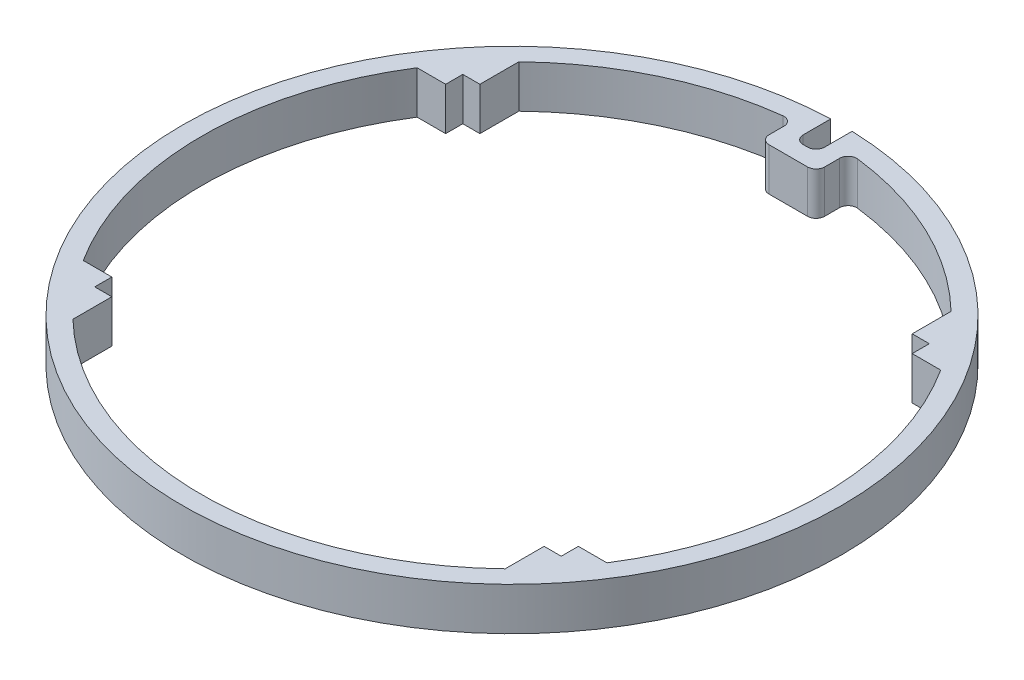
ISO-10303-21;
HEADER;
FILE_DESCRIPTION(('STEP AP214'),'2;1');
FILE_NAME('part.step','',(''),(''),'','','');
FILE_SCHEMA(('AUTOMOTIVE_DESIGN { 1 0 10303 214 1 1 1 1 }'));
ENDSEC;
DATA;
#1=APPLICATION_CONTEXT('core data for automotive mechanical design processes');
#2=APPLICATION_PROTOCOL_DEFINITION('international standard','automotive_design',2000,#1);
#3=PRODUCT_CONTEXT('',#1,'mechanical');
#4=PRODUCT('Part','Part','',(#3));
#5=PRODUCT_RELATED_PRODUCT_CATEGORY('part','',(#4));
#6=PRODUCT_DEFINITION_FORMATION('','',#4);
#7=PRODUCT_DEFINITION_CONTEXT('part definition',#1,'design');
#8=PRODUCT_DEFINITION('design','',#6,#7);
#9=PRODUCT_DEFINITION_SHAPE('','',#8);
#10=(LENGTH_UNIT() NAMED_UNIT(*) SI_UNIT(.MILLI.,.METRE.));
#11=(NAMED_UNIT(*) PLANE_ANGLE_UNIT() SI_UNIT($,.RADIAN.));
#12=(NAMED_UNIT(*) SI_UNIT($,.STERADIAN.) SOLID_ANGLE_UNIT());
#13=UNCERTAINTY_MEASURE_WITH_UNIT(LENGTH_MEASURE(1.E-05),#10,'distance_accuracy_value','');
#14=(GEOMETRIC_REPRESENTATION_CONTEXT(3) GLOBAL_UNCERTAINTY_ASSIGNED_CONTEXT((#13)) GLOBAL_UNIT_ASSIGNED_CONTEXT((#10,
#11,#12)) REPRESENTATION_CONTEXT('',''));
#15=CARTESIAN_POINT('',(0.,0.,0.));
#16=DIRECTION('',(0.,0.,1.));
#17=DIRECTION('',(1.,0.,0.));
#18=AXIS2_PLACEMENT_3D('',#15,#16,#17);
#19=CARTESIAN_POINT('',(0.,10.,0.));
#20=DIRECTION('',(0.,1.,0.));
#21=DIRECTION('',(0.,0.,1.));
#22=AXIS2_PLACEMENT_3D('',#19,#20,#21);
#23=PLANE('',#22);
#24=DIRECTION('',(0.,0.,-1.));
#25=VECTOR('',#24,1.);
#26=CARTESIAN_POINT('',(-2.5,10.,-76.5091661175313));
#27=LINE('',#26,#25);
#28=CARTESIAN_POINT('',(-2.5,10.,-70.5483094985375));
#29=VERTEX_POINT('',#28);
#30=CARTESIAN_POINT('',(-2.49999999999997,10.,-76.9594048833539));
#31=VERTEX_POINT('',#30);
#32=EDGE_CURVE('E670',#29,#31,#27,.T.);
#33=ORIENTED_EDGE('',*,*,#32,.T.);
#34=CARTESIAN_POINT('',(0.,10.,0.));
#35=DIRECTION('',(0.,1.,0.));
#36=DIRECTION('',(0.,0.,1.));
#37=AXIS2_PLACEMENT_3D('',#34,#35,#36);
#38=CIRCLE('',#37,77.);
#39=CARTESIAN_POINT('',(2.49999999999999,10.,-76.9594048833539));
#40=VERTEX_POINT('',#39);
#41=EDGE_CURVE('E363',#31,#40,#38,.T.);
#42=ORIENTED_EDGE('',*,*,#41,.T.);
#43=DIRECTION('',(0.,0.,1.));
#44=VECTOR('',#43,1.);
#45=CARTESIAN_POINT('',(2.5,10.,-76.5091661175313));
#46=LINE('',#45,#44);
#47=CARTESIAN_POINT('',(2.5,10.,-70.5483094985375));
#48=VERTEX_POINT('',#47);
#49=EDGE_CURVE('E354',#40,#48,#46,.T.);
#50=ORIENTED_EDGE('',*,*,#49,.T.);
#51=CARTESIAN_POINT('',(0.500000000000001,10.,-70.5483094985375));
#52=DIRECTION('',(0.,-1.,0.));
#53=DIRECTION('',(0.,0.,1.));
#54=AXIS2_PLACEMENT_3D('',#51,#52,#53);
#55=CIRCLE('',#54,2.);
#56=CARTESIAN_POINT('',(0.499999999999987,10.,-68.5483094985375));
#57=VERTEX_POINT('',#56);
#58=EDGE_CURVE('E658',#48,#57,#55,.T.);
#59=ORIENTED_EDGE('',*,*,#58,.T.);
#60=DIRECTION('',(-1.,0.,0.));
#61=VECTOR('',#60,1.);
#62=CARTESIAN_POINT('',(-0.499999999999986,10.,-68.5483094985375));
#63=LINE('',#62,#61);
#64=CARTESIAN_POINT('',(-0.500000000000001,10.,-68.5483094985375));
#65=VERTEX_POINT('',#64);
#66=EDGE_CURVE('E663',#57,#65,#63,.T.);
#67=ORIENTED_EDGE('',*,*,#66,.T.);
#68=CARTESIAN_POINT('',(-0.500000000000001,10.,-70.5483094985375));
#69=DIRECTION('',(0.,-1.,0.));
#70=DIRECTION('',(0.,0.,1.));
#71=AXIS2_PLACEMENT_3D('',#68,#69,#70);
#72=CIRCLE('',#71,2.);
#73=EDGE_CURVE('E665',#65,#29,#72,.T.);
#74=ORIENTED_EDGE('',*,*,#73,.T.);
#75=EDGE_LOOP('',(#33,#42,#50,#59,#67,#74));
#76=FACE_BOUND('',#75,.T.);
#77=DIRECTION('',(0.,0.,1.));
#78=VECTOR('',#77,1.);
#79=CARTESIAN_POINT('',(6.50462052289423,10.,-66.5455456480052));
#80=LINE('',#79,#78);
#81=CARTESIAN_POINT('',(6.50462052289423,10.,-70.0355190582719));
#82=VERTEX_POINT('',#81);
#83=CARTESIAN_POINT('',(6.50462052289423,10.,-66.5455456480052));
#84=VERTEX_POINT('',#83);
#85=EDGE_CURVE('E385',#82,#84,#80,.T.);
#86=ORIENTED_EDGE('',*,*,#85,.F.);
#87=CARTESIAN_POINT('',(8.50462052289423,10.,-70.0355190582719));
#88=DIRECTION('',(0.,1.,0.));
#89=DIRECTION('',(0.,0.,-1.));
#90=AXIS2_PLACEMENT_3D('',#87,#88,#89);
#91=CIRCLE('',#90,2.);
#92=CARTESIAN_POINT('',(8.74571536408187,10.,-72.0209341981237));
#93=VERTEX_POINT('',#92);
#94=EDGE_CURVE('E379',#93,#82,#91,.T.);
#95=ORIENTED_EDGE('',*,*,#94,.F.);
#96=CARTESIAN_POINT('',(0.,10.,0.));
#97=DIRECTION('',(0.,1.,0.));
#98=DIRECTION('',(0.,0.,1.));
#99=AXIS2_PLACEMENT_3D('',#96,#97,#98);
#100=CIRCLE('',#99,72.55);
#101=CARTESIAN_POINT('',(50.5,10.,-52.0888903702123));
#102=VERTEX_POINT('',#101);
#103=EDGE_CURVE('E462',#102,#93,#100,.T.);
#104=ORIENTED_EDGE('',*,*,#103,.F.);
#105=DIRECTION('',(0.,0.,-1.));
#106=VECTOR('',#105,1.);
#107=CARTESIAN_POINT('',(50.5,10.,-52.0888903702123));
#108=LINE('',#107,#106);
#109=CARTESIAN_POINT('',(50.5,10.,-43.));
#110=VERTEX_POINT('',#109);
#111=EDGE_CURVE('E457',#110,#102,#108,.T.);
#112=ORIENTED_EDGE('',*,*,#111,.F.);
#113=DIRECTION('',(-1.,0.,0.));
#114=VECTOR('',#113,1.);
#115=CARTESIAN_POINT('',(50.5,10.,-43.));
#116=LINE('',#115,#114);
#117=CARTESIAN_POINT('',(54.5,10.,-43.));
#118=VERTEX_POINT('',#117);
#119=EDGE_CURVE('E454',#118,#110,#116,.T.);
#120=ORIENTED_EDGE('',*,*,#119,.F.);
#121=DIRECTION('',(0.,0.,-1.));
#122=VECTOR('',#121,1.);
#123=CARTESIAN_POINT('',(54.5,10.,-43.));
#124=LINE('',#123,#122);
#125=CARTESIAN_POINT('',(54.5,10.,-39.));
#126=VERTEX_POINT('',#125);
#127=EDGE_CURVE('E455',#126,#118,#124,.T.);
#128=ORIENTED_EDGE('',*,*,#127,.F.);
#129=DIRECTION('',(-1.,0.,0.));
#130=VECTOR('',#129,1.);
#131=CARTESIAN_POINT('',(54.5,10.,-39.));
#132=LINE('',#131,#130);
#133=CARTESIAN_POINT('',(61.1759961095853,10.,-39.));
#134=VERTEX_POINT('',#133);
#135=EDGE_CURVE('E447',#134,#126,#132,.T.);
#136=ORIENTED_EDGE('',*,*,#135,.F.);
#137=CARTESIAN_POINT('',(0.,10.,0.));
#138=DIRECTION('',(0.,1.,0.));
#139=DIRECTION('',(0.,0.,1.));
#140=AXIS2_PLACEMENT_3D('',#137,#138,#139);
#141=CIRCLE('',#140,72.55);
#142=CARTESIAN_POINT('',(61.1759961095853,10.,39.));
#143=VERTEX_POINT('',#142);
#144=EDGE_CURVE('E446',#143,#134,#141,.T.);
#145=ORIENTED_EDGE('',*,*,#144,.F.);
#146=DIRECTION('',(1.,0.,0.));
#147=VECTOR('',#146,1.);
#148=CARTESIAN_POINT('',(54.5,10.,39.));
#149=LINE('',#148,#147);
#150=CARTESIAN_POINT('',(54.5,10.,39.));
#151=VERTEX_POINT('',#150);
#152=EDGE_CURVE('E441',#151,#143,#149,.T.);
#153=ORIENTED_EDGE('',*,*,#152,.F.);
#154=DIRECTION('',(0.,0.,-1.));
#155=VECTOR('',#154,1.);
#156=CARTESIAN_POINT('',(54.5,10.,39.));
#157=LINE('',#156,#155);
#158=CARTESIAN_POINT('',(54.5,10.,43.));
#159=VERTEX_POINT('',#158);
#160=EDGE_CURVE('E439',#159,#151,#157,.T.);
#161=ORIENTED_EDGE('',*,*,#160,.F.);
#162=DIRECTION('',(1.,0.,0.));
#163=VECTOR('',#162,1.);
#164=CARTESIAN_POINT('',(54.5,10.,43.));
#165=LINE('',#164,#163);
#166=CARTESIAN_POINT('',(50.5,10.,43.));
#167=VERTEX_POINT('',#166);
#168=EDGE_CURVE('E437',#167,#159,#165,.T.);
#169=ORIENTED_EDGE('',*,*,#168,.F.);
#170=DIRECTION('',(0.,0.,-1.));
#171=VECTOR('',#170,1.);
#172=CARTESIAN_POINT('',(50.5,10.,52.0888903702124));
#173=LINE('',#172,#171);
#174=CARTESIAN_POINT('',(50.5,10.,52.0888903702123));
#175=VERTEX_POINT('',#174);
#176=EDGE_CURVE('E434',#175,#167,#173,.T.);
#177=ORIENTED_EDGE('',*,*,#176,.F.);
#178=CARTESIAN_POINT('',(0.,10.,0.));
#179=DIRECTION('',(0.,1.,0.));
#180=DIRECTION('',(0.,0.,1.));
#181=AXIS2_PLACEMENT_3D('',#178,#179,#180);
#182=CIRCLE('',#181,72.55);
#183=CARTESIAN_POINT('',(-50.5,10.,52.0888903702123));
#184=VERTEX_POINT('',#183);
#185=EDGE_CURVE('E432',#184,#175,#182,.T.);
#186=ORIENTED_EDGE('',*,*,#185,.F.);
#187=DIRECTION('',(0.,0.,1.));
#188=VECTOR('',#187,1.);
#189=CARTESIAN_POINT('',(-50.5,10.,43.));
#190=LINE('',#189,#188);
#191=CARTESIAN_POINT('',(-50.5,10.,43.));
#192=VERTEX_POINT('',#191);
#193=EDGE_CURVE('E426',#192,#184,#190,.T.);
#194=ORIENTED_EDGE('',*,*,#193,.F.);
#195=DIRECTION('',(1.,0.,0.));
#196=VECTOR('',#195,1.);
#197=CARTESIAN_POINT('',(-54.5,10.,43.));
#198=LINE('',#197,#196);
#199=CARTESIAN_POINT('',(-54.5,10.,43.));
#200=VERTEX_POINT('',#199);
#201=EDGE_CURVE('E421',#200,#192,#198,.T.);
#202=ORIENTED_EDGE('',*,*,#201,.F.);
#203=DIRECTION('',(0.,0.,1.));
#204=VECTOR('',#203,1.);
#205=CARTESIAN_POINT('',(-54.5,10.,39.));
#206=LINE('',#205,#204);
#207=CARTESIAN_POINT('',(-54.5,10.,39.));
#208=VERTEX_POINT('',#207);
#209=EDGE_CURVE('E425',#208,#200,#206,.T.);
#210=ORIENTED_EDGE('',*,*,#209,.F.);
#211=DIRECTION('',(1.,0.,0.));
#212=VECTOR('',#211,1.);
#213=CARTESIAN_POINT('',(-54.5,10.,39.));
#214=LINE('',#213,#212);
#215=CARTESIAN_POINT('',(-61.1759961095853,10.,39.));
#216=VERTEX_POINT('',#215);
#217=EDGE_CURVE('E416',#216,#208,#214,.T.);
#218=ORIENTED_EDGE('',*,*,#217,.F.);
#219=CARTESIAN_POINT('',(0.314534491970608,10.,0.));
#220=DIRECTION('',(0.,1.,0.));
#221=DIRECTION('',(0.,0.,1.));
#222=AXIS2_PLACEMENT_3D('',#219,#220,#221);
#223=CIRCLE('',#222,72.8154197520064);
#224=CARTESIAN_POINT('',(-61.1759961095853,10.,-39.));
#225=VERTEX_POINT('',#224);
#226=EDGE_CURVE('E417',#225,#216,#223,.T.);
#227=ORIENTED_EDGE('',*,*,#226,.F.);
#228=DIRECTION('',(-1.,0.,0.));
#229=VECTOR('',#228,1.);
#230=CARTESIAN_POINT('',(-54.5,10.,-39.));
#231=LINE('',#230,#229);
#232=CARTESIAN_POINT('',(-54.5,10.,-39.));
#233=VERTEX_POINT('',#232);
#234=EDGE_CURVE('E412',#233,#225,#231,.T.);
#235=ORIENTED_EDGE('',*,*,#234,.F.);
#236=DIRECTION('',(0.,0.,1.));
#237=VECTOR('',#236,1.);
#238=CARTESIAN_POINT('',(-54.5,10.,-39.));
#239=LINE('',#238,#237);
#240=CARTESIAN_POINT('',(-54.5,10.,-43.));
#241=VERTEX_POINT('',#240);
#242=EDGE_CURVE('E409',#241,#233,#239,.T.);
#243=ORIENTED_EDGE('',*,*,#242,.F.);
#244=DIRECTION('',(-1.,0.,0.));
#245=VECTOR('',#244,1.);
#246=CARTESIAN_POINT('',(-54.5,10.,-43.));
#247=LINE('',#246,#245);
#248=CARTESIAN_POINT('',(-50.5,10.,-43.));
#249=VERTEX_POINT('',#248);
#250=EDGE_CURVE('E410',#249,#241,#247,.T.);
#251=ORIENTED_EDGE('',*,*,#250,.F.);
#252=DIRECTION('',(0.,0.,1.));
#253=VECTOR('',#252,1.);
#254=CARTESIAN_POINT('',(-50.5,10.,-52.0888903702123));
#255=LINE('',#254,#253);
#256=CARTESIAN_POINT('',(-50.5,10.,-52.0888903702123));
#257=VERTEX_POINT('',#256);
#258=EDGE_CURVE('E402',#257,#249,#255,.T.);
#259=ORIENTED_EDGE('',*,*,#258,.F.);
#260=CARTESIAN_POINT('',(0.,10.,0.));
#261=DIRECTION('',(0.,1.,0.));
#262=DIRECTION('',(0.,0.,1.));
#263=AXIS2_PLACEMENT_3D('',#260,#261,#262);
#264=CIRCLE('',#263,72.55);
#265=CARTESIAN_POINT('',(-8.73983087504542,10.,-72.0216485251178));
#266=VERTEX_POINT('',#265);
#267=EDGE_CURVE('E401',#266,#257,#264,.T.);
#268=ORIENTED_EDGE('',*,*,#267,.F.);
#269=CARTESIAN_POINT('',(-8.49889825271474,10.,-70.0362136932744));
#270=DIRECTION('',(0.,1.,0.));
#271=DIRECTION('',(0.,0.,1.));
#272=AXIS2_PLACEMENT_3D('',#269,#270,#271);
#273=CIRCLE('',#272,2.00000000000001);
#274=CARTESIAN_POINT('',(-6.49889825271474,10.,-70.0362136932744));
#275=VERTEX_POINT('',#274);
#276=EDGE_CURVE('E396',#275,#266,#273,.T.);
#277=ORIENTED_EDGE('',*,*,#276,.F.);
#278=DIRECTION('',(0.,0.,-1.));
#279=VECTOR('',#278,1.);
#280=CARTESIAN_POINT('',(-6.49889825271474,10.,-70.0362136932744));
#281=LINE('',#280,#279);
#282=CARTESIAN_POINT('',(-6.49889825271474,10.,-66.5455456480052));
#283=VERTEX_POINT('',#282);
#284=EDGE_CURVE('E394',#283,#275,#281,.T.);
#285=ORIENTED_EDGE('',*,*,#284,.F.);
#286=CARTESIAN_POINT('',(-4.49889825271474,10.,-66.5455456480052));
#287=DIRECTION('',(0.,-1.,0.));
#288=DIRECTION('',(0.,0.,1.));
#289=AXIS2_PLACEMENT_3D('',#286,#287,#288);
#290=CIRCLE('',#289,2.);
#291=CARTESIAN_POINT('',(-4.49889825271473,10.,-64.5455456480052));
#292=VERTEX_POINT('',#291);
#293=EDGE_CURVE('E392',#292,#283,#290,.T.);
#294=ORIENTED_EDGE('',*,*,#293,.F.);
#295=DIRECTION('',(-1.,0.,0.));
#296=VECTOR('',#295,1.);
#297=CARTESIAN_POINT('',(-4.49889825271473,10.,-64.5455456480052));
#298=LINE('',#297,#296);
#299=CARTESIAN_POINT('',(4.50462052289422,10.,-64.5455456480052));
#300=VERTEX_POINT('',#299);
#301=EDGE_CURVE('E389',#300,#292,#298,.T.);
#302=ORIENTED_EDGE('',*,*,#301,.F.);
#303=CARTESIAN_POINT('',(4.50462052289423,10.,-66.5455456480052));
#304=DIRECTION('',(0.,-1.,0.));
#305=DIRECTION('',(0.,0.,1.));
#306=AXIS2_PLACEMENT_3D('',#303,#304,#305);
#307=CIRCLE('',#306,2.);
#308=EDGE_CURVE('E387',#84,#300,#307,.T.);
#309=ORIENTED_EDGE('',*,*,#308,.F.);
#310=EDGE_LOOP('',(#86,#95,#104,#112,#120,#128,#136,#145,#153,#161,#169,#177,#186,#194,#202,
#210,#218,#227,#235,#243,#251,#259,#268,#277,#285,#294,#302,#309));
#311=FACE_BOUND('',#310,.T.);
#312=ADVANCED_FACE('F120',(#76,#311),#23,.T.);
#313=CARTESIAN_POINT('',(0.,0.,0.));
#314=DIRECTION('',(0.,1.,0.));
#315=DIRECTION('',(0.,0.,1.));
#316=AXIS2_PLACEMENT_3D('',#313,#314,#315);
#317=PLANE('',#316);
#318=DIRECTION('',(0.,0.,1.));
#319=VECTOR('',#318,1.);
#320=CARTESIAN_POINT('',(2.5,0.,-76.5091661175313));
#321=LINE('',#320,#319);
#322=CARTESIAN_POINT('',(2.49999999999999,0.,-76.9594048833539));
#323=VERTEX_POINT('',#322);
#324=CARTESIAN_POINT('',(2.5,0.,-70.5483094985375));
#325=VERTEX_POINT('',#324);
#326=EDGE_CURVE('E369',#323,#325,#321,.T.);
#327=ORIENTED_EDGE('',*,*,#326,.F.);
#328=CARTESIAN_POINT('',(0.,0.,0.));
#329=DIRECTION('',(0.,1.,0.));
#330=DIRECTION('',(0.,0.,1.));
#331=AXIS2_PLACEMENT_3D('',#328,#329,#330);
#332=CIRCLE('',#331,77.);
#333=CARTESIAN_POINT('',(-2.49999999999997,0.,-76.9594048833539));
#334=VERTEX_POINT('',#333);
#335=EDGE_CURVE('E361',#334,#323,#332,.T.);
#336=ORIENTED_EDGE('',*,*,#335,.F.);
#337=DIRECTION('',(0.,0.,-1.));
#338=VECTOR('',#337,1.);
#339=CARTESIAN_POINT('',(-2.5,0.,-76.5091661175313));
#340=LINE('',#339,#338);
#341=CARTESIAN_POINT('',(-2.5,0.,-70.5483094985375));
#342=VERTEX_POINT('',#341);
#343=EDGE_CURVE('E345',#342,#334,#340,.T.);
#344=ORIENTED_EDGE('',*,*,#343,.F.);
#345=CARTESIAN_POINT('',(-0.500000000000001,0.,-70.5483094985375));
#346=DIRECTION('',(0.,-1.,0.));
#347=DIRECTION('',(0.,0.,1.));
#348=AXIS2_PLACEMENT_3D('',#345,#346,#347);
#349=CIRCLE('',#348,2.);
#350=CARTESIAN_POINT('',(-0.500000000000001,0.,-68.5483094985375));
#351=VERTEX_POINT('',#350);
#352=EDGE_CURVE('E352',#351,#342,#349,.T.);
#353=ORIENTED_EDGE('',*,*,#352,.F.);
#354=DIRECTION('',(-1.,0.,0.));
#355=VECTOR('',#354,1.);
#356=CARTESIAN_POINT('',(-0.499999999999986,0.,-68.5483094985375));
#357=LINE('',#356,#355);
#358=CARTESIAN_POINT('',(0.499999999999987,0.,-68.5483094985375));
#359=VERTEX_POINT('',#358);
#360=EDGE_CURVE('E674',#359,#351,#357,.T.);
#361=ORIENTED_EDGE('',*,*,#360,.F.);
#362=CARTESIAN_POINT('',(0.500000000000001,0.,-70.5483094985375));
#363=DIRECTION('',(0.,-1.,0.));
#364=DIRECTION('',(0.,0.,1.));
#365=AXIS2_PLACEMENT_3D('',#362,#363,#364);
#366=CIRCLE('',#365,2.);
#367=EDGE_CURVE('E675',#325,#359,#366,.T.);
#368=ORIENTED_EDGE('',*,*,#367,.F.);
#369=EDGE_LOOP('',(#327,#336,#344,#353,#361,#368));
#370=FACE_BOUND('',#369,.T.);
#371=CARTESIAN_POINT('',(8.50462052289423,0.,-70.0355190582719));
#372=DIRECTION('',(0.,1.,0.));
#373=DIRECTION('',(0.,0.,-1.));
#374=AXIS2_PLACEMENT_3D('',#371,#372,#373);
#375=CIRCLE('',#374,2.);
#376=CARTESIAN_POINT('',(8.74571536408187,0.,-72.0209341981237));
#377=VERTEX_POINT('',#376);
#378=CARTESIAN_POINT('',(6.50462052289423,0.,-70.0355190582719));
#379=VERTEX_POINT('',#378);
#380=EDGE_CURVE('E141',#377,#379,#375,.T.);
#381=ORIENTED_EDGE('',*,*,#380,.T.);
#382=DIRECTION('',(0.,0.,1.));
#383=VECTOR('',#382,1.);
#384=CARTESIAN_POINT('',(6.50462052289423,0.,-66.5455456480052));
#385=LINE('',#384,#383);
#386=CARTESIAN_POINT('',(6.50462052289423,0.,-66.5455456480052));
#387=VERTEX_POINT('',#386);
#388=EDGE_CURVE('E470',#379,#387,#385,.T.);
#389=ORIENTED_EDGE('',*,*,#388,.T.);
#390=CARTESIAN_POINT('',(4.50462052289423,0.,-66.5455456480052));
#391=DIRECTION('',(0.,-1.,0.));
#392=DIRECTION('',(0.,0.,1.));
#393=AXIS2_PLACEMENT_3D('',#390,#391,#392);
#394=CIRCLE('',#393,2.);
#395=CARTESIAN_POINT('',(4.50462052289422,0.,-64.5455456480052));
#396=VERTEX_POINT('',#395);
#397=EDGE_CURVE('E472',#387,#396,#394,.T.);
#398=ORIENTED_EDGE('',*,*,#397,.T.);
#399=DIRECTION('',(-1.,0.,0.));
#400=VECTOR('',#399,1.);
#401=CARTESIAN_POINT('',(-4.49889825271473,0.,-64.5455456480052));
#402=LINE('',#401,#400);
#403=CARTESIAN_POINT('',(-4.49889825271473,0.,-64.5455456480052));
#404=VERTEX_POINT('',#403);
#405=EDGE_CURVE('E473',#396,#404,#402,.T.);
#406=ORIENTED_EDGE('',*,*,#405,.T.);
#407=CARTESIAN_POINT('',(-4.49889825271474,0.,-66.5455456480052));
#408=DIRECTION('',(0.,-1.,0.));
#409=DIRECTION('',(0.,0.,1.));
#410=AXIS2_PLACEMENT_3D('',#407,#408,#409);
#411=CIRCLE('',#410,2.);
#412=CARTESIAN_POINT('',(-6.49889825271474,0.,-66.5455456480052));
#413=VERTEX_POINT('',#412);
#414=EDGE_CURVE('E479',#404,#413,#411,.T.);
#415=ORIENTED_EDGE('',*,*,#414,.T.);
#416=DIRECTION('',(0.,0.,-1.));
#417=VECTOR('',#416,1.);
#418=CARTESIAN_POINT('',(-6.49889825271474,0.,-70.0362136932744));
#419=LINE('',#418,#417);
#420=CARTESIAN_POINT('',(-6.49889825271474,0.,-70.0362136932744));
#421=VERTEX_POINT('',#420);
#422=EDGE_CURVE('E481',#413,#421,#419,.T.);
#423=ORIENTED_EDGE('',*,*,#422,.T.);
#424=CARTESIAN_POINT('',(-8.49889825271474,0.,-70.0362136932744));
#425=DIRECTION('',(0.,1.,0.));
#426=DIRECTION('',(0.,0.,1.));
#427=AXIS2_PLACEMENT_3D('',#424,#425,#426);
#428=CIRCLE('',#427,2.00000000000001);
#429=CARTESIAN_POINT('',(-8.73983087504542,0.,-72.0216485251178));
#430=VERTEX_POINT('',#429);
#431=EDGE_CURVE('E490',#421,#430,#428,.T.);
#432=ORIENTED_EDGE('',*,*,#431,.T.);
#433=CARTESIAN_POINT('',(0.,0.,0.));
#434=DIRECTION('',(0.,1.,0.));
#435=DIRECTION('',(0.,0.,1.));
#436=AXIS2_PLACEMENT_3D('',#433,#434,#435);
#437=CIRCLE('',#436,72.55);
#438=CARTESIAN_POINT('',(-50.5,0.,-52.0888903702123));
#439=VERTEX_POINT('',#438);
#440=EDGE_CURVE('E491',#430,#439,#437,.T.);
#441=ORIENTED_EDGE('',*,*,#440,.T.);
#442=DIRECTION('',(0.,0.,1.));
#443=VECTOR('',#442,1.);
#444=CARTESIAN_POINT('',(-50.5,0.,-52.0888903702123));
#445=LINE('',#444,#443);
#446=CARTESIAN_POINT('',(-50.5,0.,-43.));
#447=VERTEX_POINT('',#446);
#448=EDGE_CURVE('E494',#439,#447,#445,.T.);
#449=ORIENTED_EDGE('',*,*,#448,.T.);
#450=DIRECTION('',(-1.,0.,0.));
#451=VECTOR('',#450,1.);
#452=CARTESIAN_POINT('',(-54.5,0.,-43.));
#453=LINE('',#452,#451);
#454=CARTESIAN_POINT('',(-54.5,0.,-43.));
#455=VERTEX_POINT('',#454);
#456=EDGE_CURVE('E497',#447,#455,#453,.T.);
#457=ORIENTED_EDGE('',*,*,#456,.T.);
#458=DIRECTION('',(0.,0.,1.));
#459=VECTOR('',#458,1.);
#460=CARTESIAN_POINT('',(-54.5,0.,-39.));
#461=LINE('',#460,#459);
#462=CARTESIAN_POINT('',(-54.5,0.,-39.));
#463=VERTEX_POINT('',#462);
#464=EDGE_CURVE('E502',#455,#463,#461,.T.);
#465=ORIENTED_EDGE('',*,*,#464,.T.);
#466=DIRECTION('',(-1.,0.,0.));
#467=VECTOR('',#466,1.);
#468=CARTESIAN_POINT('',(-54.5,0.,-39.));
#469=LINE('',#468,#467);
#470=CARTESIAN_POINT('',(-61.1759961095853,0.,-39.));
#471=VERTEX_POINT('',#470);
#472=EDGE_CURVE('E510',#463,#471,#469,.T.);
#473=ORIENTED_EDGE('',*,*,#472,.T.);
#474=CARTESIAN_POINT('',(0.314534491970608,0.,0.));
#475=DIRECTION('',(0.,1.,0.));
#476=DIRECTION('',(0.,0.,1.));
#477=AXIS2_PLACEMENT_3D('',#474,#475,#476);
#478=CIRCLE('',#477,72.8154197520064);
#479=CARTESIAN_POINT('',(-61.1759961095853,0.,39.));
#480=VERTEX_POINT('',#479);
#481=EDGE_CURVE('E512',#471,#480,#478,.T.);
#482=ORIENTED_EDGE('',*,*,#481,.T.);
#483=DIRECTION('',(1.,0.,0.));
#484=VECTOR('',#483,1.);
#485=CARTESIAN_POINT('',(-54.5,0.,39.));
#486=LINE('',#485,#484);
#487=CARTESIAN_POINT('',(-54.5,0.,39.));
#488=VERTEX_POINT('',#487);
#489=EDGE_CURVE('E511',#480,#488,#486,.T.);
#490=ORIENTED_EDGE('',*,*,#489,.T.);
#491=DIRECTION('',(0.,0.,1.));
#492=VECTOR('',#491,1.);
#493=CARTESIAN_POINT('',(-54.5,0.,39.));
#494=LINE('',#493,#492);
#495=CARTESIAN_POINT('',(-54.5,0.,43.));
#496=VERTEX_POINT('',#495);
#497=EDGE_CURVE('E519',#488,#496,#494,.T.);
#498=ORIENTED_EDGE('',*,*,#497,.T.);
#499=DIRECTION('',(1.,0.,0.));
#500=VECTOR('',#499,1.);
#501=CARTESIAN_POINT('',(-54.5,0.,43.));
#502=LINE('',#501,#500);
#503=CARTESIAN_POINT('',(-50.5,0.,43.));
#504=VERTEX_POINT('',#503);
#505=EDGE_CURVE('E523',#496,#504,#502,.T.);
#506=ORIENTED_EDGE('',*,*,#505,.T.);
#507=DIRECTION('',(0.,0.,1.));
#508=VECTOR('',#507,1.);
#509=CARTESIAN_POINT('',(-50.5,0.,43.));
#510=LINE('',#509,#508);
#511=CARTESIAN_POINT('',(-50.5,0.,52.0888903702123));
#512=VERTEX_POINT('',#511);
#513=EDGE_CURVE('E527',#504,#512,#510,.T.);
#514=ORIENTED_EDGE('',*,*,#513,.T.);
#515=CARTESIAN_POINT('',(0.,0.,0.));
#516=DIRECTION('',(0.,1.,0.));
#517=DIRECTION('',(0.,0.,1.));
#518=AXIS2_PLACEMENT_3D('',#515,#516,#517);
#519=CIRCLE('',#518,72.55);
#520=CARTESIAN_POINT('',(50.5,0.,52.0888903702123));
#521=VERTEX_POINT('',#520);
#522=EDGE_CURVE('E533',#512,#521,#519,.T.);
#523=ORIENTED_EDGE('',*,*,#522,.T.);
#524=DIRECTION('',(0.,0.,-1.));
#525=VECTOR('',#524,1.);
#526=CARTESIAN_POINT('',(50.5,0.,52.0888903702124));
#527=LINE('',#526,#525);
#528=CARTESIAN_POINT('',(50.5,0.,43.));
#529=VERTEX_POINT('',#528);
#530=EDGE_CURVE('E532',#521,#529,#527,.T.);
#531=ORIENTED_EDGE('',*,*,#530,.T.);
#532=DIRECTION('',(1.,0.,0.));
#533=VECTOR('',#532,1.);
#534=CARTESIAN_POINT('',(54.5,0.,43.));
#535=LINE('',#534,#533);
#536=CARTESIAN_POINT('',(54.5,0.,43.));
#537=VERTEX_POINT('',#536);
#538=EDGE_CURVE('E537',#529,#537,#535,.T.);
#539=ORIENTED_EDGE('',*,*,#538,.T.);
#540=DIRECTION('',(0.,0.,-1.));
#541=VECTOR('',#540,1.);
#542=CARTESIAN_POINT('',(54.5,0.,39.));
#543=LINE('',#542,#541);
#544=CARTESIAN_POINT('',(54.5,0.,39.));
#545=VERTEX_POINT('',#544);
#546=EDGE_CURVE('E543',#537,#545,#543,.T.);
#547=ORIENTED_EDGE('',*,*,#546,.T.);
#548=DIRECTION('',(1.,0.,0.));
#549=VECTOR('',#548,1.);
#550=CARTESIAN_POINT('',(54.5,0.,39.));
#551=LINE('',#550,#549);
#552=CARTESIAN_POINT('',(61.1759961095853,0.,39.));
#553=VERTEX_POINT('',#552);
#554=EDGE_CURVE('E550',#545,#553,#551,.T.);
#555=ORIENTED_EDGE('',*,*,#554,.T.);
#556=CARTESIAN_POINT('',(0.,0.,0.));
#557=DIRECTION('',(0.,1.,0.));
#558=DIRECTION('',(0.,0.,1.));
#559=AXIS2_PLACEMENT_3D('',#556,#557,#558);
#560=CIRCLE('',#559,72.55);
#561=CARTESIAN_POINT('',(61.1759961095853,0.,-39.));
#562=VERTEX_POINT('',#561);
#563=EDGE_CURVE('E552',#553,#562,#560,.T.);
#564=ORIENTED_EDGE('',*,*,#563,.T.);
#565=DIRECTION('',(-1.,0.,0.));
#566=VECTOR('',#565,1.);
#567=CARTESIAN_POINT('',(54.5,0.,-39.));
#568=LINE('',#567,#566);
#569=CARTESIAN_POINT('',(54.5,0.,-39.));
#570=VERTEX_POINT('',#569);
#571=EDGE_CURVE('E553',#562,#570,#568,.T.);
#572=ORIENTED_EDGE('',*,*,#571,.T.);
#573=DIRECTION('',(0.,0.,-1.));
#574=VECTOR('',#573,1.);
#575=CARTESIAN_POINT('',(54.5,0.,-43.));
#576=LINE('',#575,#574);
#577=CARTESIAN_POINT('',(54.5,0.,-43.));
#578=VERTEX_POINT('',#577);
#579=EDGE_CURVE('E559',#570,#578,#576,.T.);
#580=ORIENTED_EDGE('',*,*,#579,.T.);
#581=DIRECTION('',(-1.,0.,0.));
#582=VECTOR('',#581,1.);
#583=CARTESIAN_POINT('',(50.5,0.,-43.));
#584=LINE('',#583,#582);
#585=CARTESIAN_POINT('',(50.5,0.,-43.));
#586=VERTEX_POINT('',#585);
#587=EDGE_CURVE('E561',#578,#586,#584,.T.);
#588=ORIENTED_EDGE('',*,*,#587,.T.);
#589=DIRECTION('',(0.,0.,-1.));
#590=VECTOR('',#589,1.);
#591=CARTESIAN_POINT('',(50.5,0.,-52.0888903702123));
#592=LINE('',#591,#590);
#593=CARTESIAN_POINT('',(50.5,0.,-52.0888903702123));
#594=VERTEX_POINT('',#593);
#595=EDGE_CURVE('E570',#586,#594,#592,.T.);
#596=ORIENTED_EDGE('',*,*,#595,.T.);
#597=CARTESIAN_POINT('',(0.,0.,0.));
#598=DIRECTION('',(0.,1.,0.));
#599=DIRECTION('',(0.,0.,1.));
#600=AXIS2_PLACEMENT_3D('',#597,#598,#599);
#601=CIRCLE('',#600,72.55);
#602=EDGE_CURVE('E381',#594,#377,#601,.T.);
#603=ORIENTED_EDGE('',*,*,#602,.T.);
#604=EDGE_LOOP('',(#381,#389,#398,#406,#415,#423,#432,#441,#449,#457,#465,#473,#482,#490,#498,
#506,#514,#523,#531,#539,#547,#555,#564,#572,#580,#588,#596,#603));
#605=FACE_BOUND('',#604,.T.);
#606=ADVANCED_FACE('F370',(#370,#605),#317,.F.);
#607=CARTESIAN_POINT('',(2.5,10.,-76.5091661175313));
#608=DIRECTION('',(1.,0.,0.));
#609=DIRECTION('',(0.,0.,-1.));
#610=AXIS2_PLACEMENT_3D('',#607,#608,#609);
#611=PLANE('',#610);
#612=ORIENTED_EDGE('',*,*,#326,.T.);
#613=DIRECTION('',(0.,-1.,0.));
#614=VECTOR('',#613,1.);
#615=CARTESIAN_POINT('',(2.5,10.,-70.5483094985375));
#616=LINE('',#615,#614);
#617=EDGE_CURVE('E12',#48,#325,#616,.T.);
#618=ORIENTED_EDGE('',*,*,#617,.F.);
#619=ORIENTED_EDGE('',*,*,#49,.F.);
#620=DIRECTION('',(0.,1.,0.));
#621=VECTOR('',#620,1.);
#622=CARTESIAN_POINT('',(2.49999999999999,0.,-76.9594048833539));
#623=LINE('',#622,#621);
#624=EDGE_CURVE('E364',#323,#40,#623,.T.);
#625=ORIENTED_EDGE('',*,*,#624,.F.);
#626=EDGE_LOOP('',(#612,#618,#619,#625));
#627=FACE_BOUND('',#626,.T.);
#628=ADVANCED_FACE('F119',(#627),#611,.F.);
#629=CARTESIAN_POINT('',(0.500000000000001,10.,-70.5483094985375));
#630=DIRECTION('',(0.,-1.,0.));
#631=DIRECTION('',(0.,0.,-1.));
#632=AXIS2_PLACEMENT_3D('',#629,#630,#631);
#633=CYLINDRICAL_SURFACE('',#632,2.);
#634=ORIENTED_EDGE('',*,*,#367,.T.);
#635=DIRECTION('',(0.,-1.,0.));
#636=VECTOR('',#635,1.);
#637=CARTESIAN_POINT('',(0.499999999999987,10.,-68.5483094985375));
#638=LINE('',#637,#636);
#639=EDGE_CURVE('E128',#57,#359,#638,.T.);
#640=ORIENTED_EDGE('',*,*,#639,.F.);
#641=ORIENTED_EDGE('',*,*,#58,.F.);
#642=ORIENTED_EDGE('',*,*,#617,.T.);
#643=EDGE_LOOP('',(#634,#640,#641,#642));
#644=FACE_BOUND('',#643,.T.);
#645=ADVANCED_FACE('F702',(#644),#633,.F.);
#646=CARTESIAN_POINT('',(-0.499999999999986,10.,-68.5483094985375));
#647=DIRECTION('',(0.,0.,1.));
#648=DIRECTION('',(1.,0.,0.));
#649=AXIS2_PLACEMENT_3D('',#646,#647,#648);
#650=PLANE('',#649);
#651=ORIENTED_EDGE('',*,*,#360,.T.);
#652=DIRECTION('',(0.,-1.,0.));
#653=VECTOR('',#652,1.);
#654=CARTESIAN_POINT('',(-0.500000000000001,10.,-68.5483094985375));
#655=LINE('',#654,#653);
#656=EDGE_CURVE('E685',#65,#351,#655,.T.);
#657=ORIENTED_EDGE('',*,*,#656,.F.);
#658=ORIENTED_EDGE('',*,*,#66,.F.);
#659=ORIENTED_EDGE('',*,*,#639,.T.);
#660=EDGE_LOOP('',(#651,#657,#658,#659));
#661=FACE_BOUND('',#660,.T.);
#662=ADVANCED_FACE('F692',(#661),#650,.F.);
#663=CARTESIAN_POINT('',(-0.500000000000001,10.,-70.5483094985375));
#664=DIRECTION('',(0.,-1.,0.));
#665=DIRECTION('',(0.,0.,-1.));
#666=AXIS2_PLACEMENT_3D('',#663,#664,#665);
#667=CYLINDRICAL_SURFACE('',#666,2.);
#668=ORIENTED_EDGE('',*,*,#352,.T.);
#669=DIRECTION('',(0.,-1.,0.));
#670=VECTOR('',#669,1.);
#671=CARTESIAN_POINT('',(-2.5,10.,-70.5483094985375));
#672=LINE('',#671,#670);
#673=EDGE_CURVE('E350',#29,#342,#672,.T.);
#674=ORIENTED_EDGE('',*,*,#673,.F.);
#675=ORIENTED_EDGE('',*,*,#73,.F.);
#676=ORIENTED_EDGE('',*,*,#656,.T.);
#677=EDGE_LOOP('',(#668,#674,#675,#676));
#678=FACE_BOUND('',#677,.T.);
#679=ADVANCED_FACE('F697',(#678),#667,.F.);
#680=CARTESIAN_POINT('',(-2.5,10.,-76.5091661175313));
#681=DIRECTION('',(-1.,0.,0.));
#682=DIRECTION('',(0.,0.,1.));
#683=AXIS2_PLACEMENT_3D('',#680,#681,#682);
#684=PLANE('',#683);
#685=ORIENTED_EDGE('',*,*,#343,.T.);
#686=DIRECTION('',(0.,1.,0.));
#687=VECTOR('',#686,1.);
#688=CARTESIAN_POINT('',(-2.49999999999997,0.,-76.9594048833539));
#689=LINE('',#688,#687);
#690=EDGE_CURVE('E348',#334,#31,#689,.T.);
#691=ORIENTED_EDGE('',*,*,#690,.T.);
#692=ORIENTED_EDGE('',*,*,#32,.F.);
#693=ORIENTED_EDGE('',*,*,#673,.T.);
#694=EDGE_LOOP('',(#685,#691,#692,#693));
#695=FACE_BOUND('',#694,.T.);
#696=ADVANCED_FACE('F344',(#695),#684,.F.);
#697=CARTESIAN_POINT('',(8.50462052289423,10.,-70.0355190582719));
#698=DIRECTION('',(0.,-1.,0.));
#699=DIRECTION('',(0.,0.,-1.));
#700=AXIS2_PLACEMENT_3D('',#697,#698,#699);
#701=CYLINDRICAL_SURFACE('',#700,2.);
#702=ORIENTED_EDGE('',*,*,#380,.F.);
#703=DIRECTION('',(0.,-1.,0.));
#704=VECTOR('',#703,1.);
#705=CARTESIAN_POINT('',(8.74571536408187,10.,-72.0209341981237));
#706=LINE('',#705,#704);
#707=EDGE_CURVE('E461',#93,#377,#706,.T.);
#708=ORIENTED_EDGE('',*,*,#707,.F.);
#709=ORIENTED_EDGE('',*,*,#94,.T.);
#710=DIRECTION('',(0.,-1.,0.));
#711=VECTOR('',#710,1.);
#712=CARTESIAN_POINT('',(6.50462052289423,10.,-70.0355190582719));
#713=LINE('',#712,#711);
#714=EDGE_CURVE('E651',#82,#379,#713,.T.);
#715=ORIENTED_EDGE('',*,*,#714,.T.);
#716=EDGE_LOOP('',(#702,#708,#709,#715));
#717=FACE_BOUND('',#716,.T.);
#718=ADVANCED_FACE('F716',(#717),#701,.F.);
#719=CARTESIAN_POINT('',(6.50462052289423,10.,-66.5455456480052));
#720=DIRECTION('',(1.,0.,0.));
#721=DIRECTION('',(0.,0.,-1.));
#722=AXIS2_PLACEMENT_3D('',#719,#720,#721);
#723=PLANE('',#722);
#724=ORIENTED_EDGE('',*,*,#388,.F.);
#725=ORIENTED_EDGE('',*,*,#714,.F.);
#726=ORIENTED_EDGE('',*,*,#85,.T.);
#727=DIRECTION('',(0.,-1.,0.));
#728=VECTOR('',#727,1.);
#729=CARTESIAN_POINT('',(6.50462052289423,10.,-66.5455456480052));
#730=LINE('',#729,#728);
#731=EDGE_CURVE('E646',#84,#387,#730,.T.);
#732=ORIENTED_EDGE('',*,*,#731,.T.);
#733=EDGE_LOOP('',(#724,#725,#726,#732));
#734=FACE_BOUND('',#733,.T.);
#735=ADVANCED_FACE('F736',(#734),#723,.T.);
#736=CARTESIAN_POINT('',(4.50462052289423,10.,-66.5455456480052));
#737=DIRECTION('',(0.,-1.,0.));
#738=DIRECTION('',(0.,0.,-1.));
#739=AXIS2_PLACEMENT_3D('',#736,#737,#738);
#740=CYLINDRICAL_SURFACE('',#739,2.);
#741=ORIENTED_EDGE('',*,*,#397,.F.);
#742=ORIENTED_EDGE('',*,*,#731,.F.);
#743=ORIENTED_EDGE('',*,*,#308,.T.);
#744=DIRECTION('',(0.,-1.,0.));
#745=VECTOR('',#744,1.);
#746=CARTESIAN_POINT('',(4.50462052289422,10.,-64.5455456480052));
#747=LINE('',#746,#745);
#748=EDGE_CURVE('E650',#300,#396,#747,.T.);
#749=ORIENTED_EDGE('',*,*,#748,.T.);
#750=EDGE_LOOP('',(#741,#742,#743,#749));
#751=FACE_BOUND('',#750,.T.);
#752=ADVANCED_FACE('F750',(#751),#740,.T.);
#753=CARTESIAN_POINT('',(-4.49889825271473,10.,-64.5455456480052));
#754=DIRECTION('',(0.,0.,1.));
#755=DIRECTION('',(1.,0.,0.));
#756=AXIS2_PLACEMENT_3D('',#753,#754,#755);
#757=PLANE('',#756);
#758=ORIENTED_EDGE('',*,*,#405,.F.);
#759=ORIENTED_EDGE('',*,*,#748,.F.);
#760=ORIENTED_EDGE('',*,*,#301,.T.);
#761=DIRECTION('',(0.,-1.,0.));
#762=VECTOR('',#761,1.);
#763=CARTESIAN_POINT('',(-4.49889825271473,10.,-64.5455456480052));
#764=LINE('',#763,#762);
#765=EDGE_CURVE('E641',#292,#404,#764,.T.);
#766=ORIENTED_EDGE('',*,*,#765,.T.);
#767=EDGE_LOOP('',(#758,#759,#760,#766));
#768=FACE_BOUND('',#767,.T.);
#769=ADVANCED_FACE('F754',(#768),#757,.T.);
#770=CARTESIAN_POINT('',(-4.49889825271474,10.,-66.5455456480052));
#771=DIRECTION('',(0.,-1.,0.));
#772=DIRECTION('',(0.,0.,-1.));
#773=AXIS2_PLACEMENT_3D('',#770,#771,#772);
#774=CYLINDRICAL_SURFACE('',#773,2.);
#775=ORIENTED_EDGE('',*,*,#414,.F.);
#776=ORIENTED_EDGE('',*,*,#765,.F.);
#777=ORIENTED_EDGE('',*,*,#293,.T.);
#778=DIRECTION('',(0.,-1.,0.));
#779=VECTOR('',#778,1.);
#780=CARTESIAN_POINT('',(-6.49889825271474,10.,-66.5455456480052));
#781=LINE('',#780,#779);
#782=EDGE_CURVE('E642',#283,#413,#781,.T.);
#783=ORIENTED_EDGE('',*,*,#782,.T.);
#784=EDGE_LOOP('',(#775,#776,#777,#783));
#785=FACE_BOUND('',#784,.T.);
#786=ADVANCED_FACE('F762',(#785),#774,.T.);
#787=CARTESIAN_POINT('',(-6.49889825271474,10.,-70.0362136932744));
#788=DIRECTION('',(-1.,0.,0.));
#789=DIRECTION('',(0.,0.,1.));
#790=AXIS2_PLACEMENT_3D('',#787,#788,#789);
#791=PLANE('',#790);
#792=ORIENTED_EDGE('',*,*,#422,.F.);
#793=ORIENTED_EDGE('',*,*,#782,.F.);
#794=ORIENTED_EDGE('',*,*,#284,.T.);
#795=DIRECTION('',(0.,-1.,0.));
#796=VECTOR('',#795,1.);
#797=CARTESIAN_POINT('',(-6.49889825271474,10.,-70.0362136932744));
#798=LINE('',#797,#796);
#799=EDGE_CURVE('E637',#275,#421,#798,.T.);
#800=ORIENTED_EDGE('',*,*,#799,.T.);
#801=EDGE_LOOP('',(#792,#793,#794,#800));
#802=FACE_BOUND('',#801,.T.);
#803=ADVANCED_FACE('F772',(#802),#791,.T.);
#804=CARTESIAN_POINT('',(-8.49889825271474,10.,-70.0362136932744));
#805=DIRECTION('',(0.,-1.,0.));
#806=DIRECTION('',(0.,0.,-1.));
#807=AXIS2_PLACEMENT_3D('',#804,#805,#806);
#808=CYLINDRICAL_SURFACE('',#807,2.00000000000001);
#809=ORIENTED_EDGE('',*,*,#431,.F.);
#810=ORIENTED_EDGE('',*,*,#799,.F.);
#811=ORIENTED_EDGE('',*,*,#276,.T.);
#812=DIRECTION('',(0.,-1.,0.));
#813=VECTOR('',#812,1.);
#814=CARTESIAN_POINT('',(-8.73983087504542,10.,-72.0216485251178));
#815=LINE('',#814,#813);
#816=EDGE_CURVE('E634',#266,#430,#815,.T.);
#817=ORIENTED_EDGE('',*,*,#816,.T.);
#818=EDGE_LOOP('',(#809,#810,#811,#817));
#819=FACE_BOUND('',#818,.T.);
#820=ADVANCED_FACE('F785',(#819),#808,.F.);
#821=CARTESIAN_POINT('',(0.,10.,0.));
#822=DIRECTION('',(0.,-1.,0.));
#823=DIRECTION('',(0.,0.,-1.));
#824=AXIS2_PLACEMENT_3D('',#821,#822,#823);
#825=CYLINDRICAL_SURFACE('',#824,72.55);
#826=ORIENTED_EDGE('',*,*,#440,.F.);
#827=ORIENTED_EDGE('',*,*,#816,.F.);
#828=ORIENTED_EDGE('',*,*,#267,.T.);
#829=DIRECTION('',(0.,-1.,0.));
#830=VECTOR('',#829,1.);
#831=CARTESIAN_POINT('',(-50.5,10.,-52.0888903702123));
#832=LINE('',#831,#830);
#833=EDGE_CURVE('E635',#257,#439,#832,.T.);
#834=ORIENTED_EDGE('',*,*,#833,.T.);
#835=EDGE_LOOP('',(#826,#827,#828,#834));
#836=FACE_BOUND('',#835,.T.);
#837=ADVANCED_FACE('F792',(#836),#825,.F.);
#838=CARTESIAN_POINT('',(-50.5,10.,-52.0888903702123));
#839=DIRECTION('',(1.,0.,0.));
#840=DIRECTION('',(0.,0.,-1.));
#841=AXIS2_PLACEMENT_3D('',#838,#839,#840);
#842=PLANE('',#841);
#843=ORIENTED_EDGE('',*,*,#448,.F.);
#844=ORIENTED_EDGE('',*,*,#833,.F.);
#845=ORIENTED_EDGE('',*,*,#258,.T.);
#846=DIRECTION('',(0.,-1.,0.));
#847=VECTOR('',#846,1.);
#848=CARTESIAN_POINT('',(-50.5,10.,-43.));
#849=LINE('',#848,#847);
#850=EDGE_CURVE('E627',#249,#447,#849,.T.);
#851=ORIENTED_EDGE('',*,*,#850,.T.);
#852=EDGE_LOOP('',(#843,#844,#845,#851));
#853=FACE_BOUND('',#852,.T.);
#854=ADVANCED_FACE('F799',(#853),#842,.T.);
#855=CARTESIAN_POINT('',(-54.5,10.,-43.));
#856=DIRECTION('',(0.,0.,1.));
#857=DIRECTION('',(1.,0.,0.));
#858=AXIS2_PLACEMENT_3D('',#855,#856,#857);
#859=PLANE('',#858);
#860=ORIENTED_EDGE('',*,*,#456,.F.);
#861=ORIENTED_EDGE('',*,*,#850,.F.);
#862=ORIENTED_EDGE('',*,*,#250,.T.);
#863=DIRECTION('',(0.,-1.,0.));
#864=VECTOR('',#863,1.);
#865=CARTESIAN_POINT('',(-54.5,10.,-43.));
#866=LINE('',#865,#864);
#867=EDGE_CURVE('E626',#241,#455,#866,.T.);
#868=ORIENTED_EDGE('',*,*,#867,.T.);
#869=EDGE_LOOP('',(#860,#861,#862,#868));
#870=FACE_BOUND('',#869,.T.);
#871=ADVANCED_FACE('F807',(#870),#859,.T.);
#872=CARTESIAN_POINT('',(-54.5,10.,-39.));
#873=DIRECTION('',(1.,0.,0.));
#874=DIRECTION('',(0.,0.,-1.));
#875=AXIS2_PLACEMENT_3D('',#872,#873,#874);
#876=PLANE('',#875);
#877=ORIENTED_EDGE('',*,*,#464,.F.);
#878=ORIENTED_EDGE('',*,*,#867,.F.);
#879=ORIENTED_EDGE('',*,*,#242,.T.);
#880=DIRECTION('',(0.,-1.,0.));
#881=VECTOR('',#880,1.);
#882=CARTESIAN_POINT('',(-54.5,10.,-39.));
#883=LINE('',#882,#881);
#884=EDGE_CURVE('E621',#233,#463,#883,.T.);
#885=ORIENTED_EDGE('',*,*,#884,.T.);
#886=EDGE_LOOP('',(#877,#878,#879,#885));
#887=FACE_BOUND('',#886,.T.);
#888=ADVANCED_FACE('F817',(#887),#876,.T.);
#889=CARTESIAN_POINT('',(-54.5,10.,-39.));
#890=DIRECTION('',(0.,0.,1.));
#891=DIRECTION('',(1.,0.,0.));
#892=AXIS2_PLACEMENT_3D('',#889,#890,#891);
#893=PLANE('',#892);
#894=ORIENTED_EDGE('',*,*,#472,.F.);
#895=ORIENTED_EDGE('',*,*,#884,.F.);
#896=ORIENTED_EDGE('',*,*,#234,.T.);
#897=DIRECTION('',(0.,-1.,0.));
#898=VECTOR('',#897,1.);
#899=CARTESIAN_POINT('',(-61.1759961095853,10.,-39.));
#900=LINE('',#899,#898);
#901=EDGE_CURVE('E619',#225,#471,#900,.T.);
#902=ORIENTED_EDGE('',*,*,#901,.T.);
#903=EDGE_LOOP('',(#894,#895,#896,#902));
#904=FACE_BOUND('',#903,.T.);
#905=ADVANCED_FACE('F830',(#904),#893,.T.);
#906=CARTESIAN_POINT('',(0.314534491970608,10.,0.));
#907=DIRECTION('',(0.,-1.,0.));
#908=DIRECTION('',(0.,0.,-1.));
#909=AXIS2_PLACEMENT_3D('',#906,#907,#908);
#910=CYLINDRICAL_SURFACE('',#909,72.8154197520064);
#911=ORIENTED_EDGE('',*,*,#481,.F.);
#912=ORIENTED_EDGE('',*,*,#901,.F.);
#913=ORIENTED_EDGE('',*,*,#226,.T.);
#914=DIRECTION('',(0.,-1.,0.));
#915=VECTOR('',#914,1.);
#916=CARTESIAN_POINT('',(-61.1759961095853,10.,39.));
#917=LINE('',#916,#915);
#918=EDGE_CURVE('E617',#216,#480,#917,.T.);
#919=ORIENTED_EDGE('',*,*,#918,.T.);
#920=EDGE_LOOP('',(#911,#912,#913,#919));
#921=FACE_BOUND('',#920,.T.);
#922=ADVANCED_FACE('F837',(#921),#910,.F.);
#923=CARTESIAN_POINT('',(-54.5,10.,39.));
#924=DIRECTION('',(0.,0.,-1.));
#925=DIRECTION('',(-1.,0.,0.));
#926=AXIS2_PLACEMENT_3D('',#923,#924,#925);
#927=PLANE('',#926);
#928=ORIENTED_EDGE('',*,*,#489,.F.);
#929=ORIENTED_EDGE('',*,*,#918,.F.);
#930=ORIENTED_EDGE('',*,*,#217,.T.);
#931=DIRECTION('',(0.,-1.,0.));
#932=VECTOR('',#931,1.);
#933=CARTESIAN_POINT('',(-54.5,10.,39.));
#934=LINE('',#933,#932);
#935=EDGE_CURVE('E614',#208,#488,#934,.T.);
#936=ORIENTED_EDGE('',*,*,#935,.T.);
#937=EDGE_LOOP('',(#928,#929,#930,#936));
#938=FACE_BOUND('',#937,.T.);
#939=ADVANCED_FACE('F844',(#938),#927,.T.);
#940=CARTESIAN_POINT('',(-54.5,10.,39.));
#941=DIRECTION('',(1.,0.,0.));
#942=DIRECTION('',(0.,0.,-1.));
#943=AXIS2_PLACEMENT_3D('',#940,#941,#942);
#944=PLANE('',#943);
#945=ORIENTED_EDGE('',*,*,#497,.F.);
#946=ORIENTED_EDGE('',*,*,#935,.F.);
#947=ORIENTED_EDGE('',*,*,#209,.T.);
#948=DIRECTION('',(0.,-1.,0.));
#949=VECTOR('',#948,1.);
#950=CARTESIAN_POINT('',(-54.5,10.,43.));
#951=LINE('',#950,#949);
#952=EDGE_CURVE('E612',#200,#496,#951,.T.);
#953=ORIENTED_EDGE('',*,*,#952,.T.);
#954=EDGE_LOOP('',(#945,#946,#947,#953));
#955=FACE_BOUND('',#954,.T.);
#956=ADVANCED_FACE('F852',(#955),#944,.T.);
#957=CARTESIAN_POINT('',(-54.5,10.,43.));
#958=DIRECTION('',(0.,0.,-1.));
#959=DIRECTION('',(-1.,0.,0.));
#960=AXIS2_PLACEMENT_3D('',#957,#958,#959);
#961=PLANE('',#960);
#962=ORIENTED_EDGE('',*,*,#505,.F.);
#963=ORIENTED_EDGE('',*,*,#952,.F.);
#964=ORIENTED_EDGE('',*,*,#201,.T.);
#965=DIRECTION('',(0.,-1.,0.));
#966=VECTOR('',#965,1.);
#967=CARTESIAN_POINT('',(-50.5,10.,43.));
#968=LINE('',#967,#966);
#969=EDGE_CURVE('E606',#192,#504,#968,.T.);
#970=ORIENTED_EDGE('',*,*,#969,.T.);
#971=EDGE_LOOP('',(#962,#963,#964,#970));
#972=FACE_BOUND('',#971,.T.);
#973=ADVANCED_FACE('F862',(#972),#961,.T.);
#974=CARTESIAN_POINT('',(-50.5,10.,43.));
#975=DIRECTION('',(1.,0.,0.));
#976=DIRECTION('',(0.,0.,-1.));
#977=AXIS2_PLACEMENT_3D('',#974,#975,#976);
#978=PLANE('',#977);
#979=ORIENTED_EDGE('',*,*,#513,.F.);
#980=ORIENTED_EDGE('',*,*,#969,.F.);
#981=ORIENTED_EDGE('',*,*,#193,.T.);
#982=DIRECTION('',(0.,-1.,0.));
#983=VECTOR('',#982,1.);
#984=CARTESIAN_POINT('',(-50.5,10.,52.0888903702123));
#985=LINE('',#984,#983);
#986=EDGE_CURVE('E601',#184,#512,#985,.T.);
#987=ORIENTED_EDGE('',*,*,#986,.T.);
#988=EDGE_LOOP('',(#979,#980,#981,#987));
#989=FACE_BOUND('',#988,.T.);
#990=ADVANCED_FACE('F875',(#989),#978,.T.);
#991=CARTESIAN_POINT('',(0.,10.,0.));
#992=DIRECTION('',(0.,-1.,0.));
#993=DIRECTION('',(0.,0.,-1.));
#994=AXIS2_PLACEMENT_3D('',#991,#992,#993);
#995=CYLINDRICAL_SURFACE('',#994,72.55);
#996=ORIENTED_EDGE('',*,*,#522,.F.);
#997=ORIENTED_EDGE('',*,*,#986,.F.);
#998=ORIENTED_EDGE('',*,*,#185,.T.);
#999=DIRECTION('',(0.,-1.,0.));
#1000=VECTOR('',#999,1.);
#1001=CARTESIAN_POINT('',(50.5,10.,52.0888903702123));
#1002=LINE('',#1001,#1000);
#1003=EDGE_CURVE('E605',#175,#521,#1002,.T.);
#1004=ORIENTED_EDGE('',*,*,#1003,.T.);
#1005=EDGE_LOOP('',(#996,#997,#998,#1004));
#1006=FACE_BOUND('',#1005,.T.);
#1007=ADVANCED_FACE('F882',(#1006),#995,.F.);
#1008=CARTESIAN_POINT('',(50.5,10.,52.0888903702124));
#1009=DIRECTION('',(-1.,0.,0.));
#1010=DIRECTION('',(0.,0.,1.));
#1011=AXIS2_PLACEMENT_3D('',#1008,#1009,#1010);
#1012=PLANE('',#1011);
#1013=ORIENTED_EDGE('',*,*,#530,.F.);
#1014=ORIENTED_EDGE('',*,*,#1003,.F.);
#1015=ORIENTED_EDGE('',*,*,#176,.T.);
#1016=DIRECTION('',(0.,-1.,0.));
#1017=VECTOR('',#1016,1.);
#1018=CARTESIAN_POINT('',(50.5,10.,43.));
#1019=LINE('',#1018,#1017);
#1020=EDGE_CURVE('E596',#167,#529,#1019,.T.);
#1021=ORIENTED_EDGE('',*,*,#1020,.T.);
#1022=EDGE_LOOP('',(#1013,#1014,#1015,#1021));
#1023=FACE_BOUND('',#1022,.T.);
#1024=ADVANCED_FACE('F889',(#1023),#1012,.T.);
#1025=CARTESIAN_POINT('',(54.5,10.,43.));
#1026=DIRECTION('',(0.,0.,-1.));
#1027=DIRECTION('',(-1.,0.,0.));
#1028=AXIS2_PLACEMENT_3D('',#1025,#1026,#1027);
#1029=PLANE('',#1028);
#1030=ORIENTED_EDGE('',*,*,#538,.F.);
#1031=ORIENTED_EDGE('',*,*,#1020,.F.);
#1032=ORIENTED_EDGE('',*,*,#168,.T.);
#1033=DIRECTION('',(0.,-1.,0.));
#1034=VECTOR('',#1033,1.);
#1035=CARTESIAN_POINT('',(54.5,10.,43.));
#1036=LINE('',#1035,#1034);
#1037=EDGE_CURVE('E597',#159,#537,#1036,.T.);
#1038=ORIENTED_EDGE('',*,*,#1037,.T.);
#1039=EDGE_LOOP('',(#1030,#1031,#1032,#1038));
#1040=FACE_BOUND('',#1039,.T.);
#1041=ADVANCED_FACE('F897',(#1040),#1029,.T.);
#1042=CARTESIAN_POINT('',(54.5,10.,39.));
#1043=DIRECTION('',(-1.,0.,0.));
#1044=DIRECTION('',(0.,0.,1.));
#1045=AXIS2_PLACEMENT_3D('',#1042,#1043,#1044);
#1046=PLANE('',#1045);
#1047=ORIENTED_EDGE('',*,*,#546,.F.);
#1048=ORIENTED_EDGE('',*,*,#1037,.F.);
#1049=ORIENTED_EDGE('',*,*,#160,.T.);
#1050=DIRECTION('',(0.,-1.,0.));
#1051=VECTOR('',#1050,1.);
#1052=CARTESIAN_POINT('',(54.5,10.,39.));
#1053=LINE('',#1052,#1051);
#1054=EDGE_CURVE('E592',#151,#545,#1053,.T.);
#1055=ORIENTED_EDGE('',*,*,#1054,.T.);
#1056=EDGE_LOOP('',(#1047,#1048,#1049,#1055));
#1057=FACE_BOUND('',#1056,.T.);
#1058=ADVANCED_FACE('F907',(#1057),#1046,.T.);
#1059=CARTESIAN_POINT('',(54.5,10.,39.));
#1060=DIRECTION('',(0.,0.,-1.));
#1061=DIRECTION('',(-1.,0.,0.));
#1062=AXIS2_PLACEMENT_3D('',#1059,#1060,#1061);
#1063=PLANE('',#1062);
#1064=ORIENTED_EDGE('',*,*,#554,.F.);
#1065=ORIENTED_EDGE('',*,*,#1054,.F.);
#1066=ORIENTED_EDGE('',*,*,#152,.T.);
#1067=DIRECTION('',(0.,-1.,0.));
#1068=VECTOR('',#1067,1.);
#1069=CARTESIAN_POINT('',(61.1759961095853,10.,39.));
#1070=LINE('',#1069,#1068);
#1071=EDGE_CURVE('E589',#143,#553,#1070,.T.);
#1072=ORIENTED_EDGE('',*,*,#1071,.T.);
#1073=EDGE_LOOP('',(#1064,#1065,#1066,#1072));
#1074=FACE_BOUND('',#1073,.T.);
#1075=ADVANCED_FACE('F920',(#1074),#1063,.T.);
#1076=CARTESIAN_POINT('',(0.,10.,0.));
#1077=DIRECTION('',(0.,-1.,0.));
#1078=DIRECTION('',(0.,0.,-1.));
#1079=AXIS2_PLACEMENT_3D('',#1076,#1077,#1078);
#1080=CYLINDRICAL_SURFACE('',#1079,72.55);
#1081=ORIENTED_EDGE('',*,*,#563,.F.);
#1082=ORIENTED_EDGE('',*,*,#1071,.F.);
#1083=ORIENTED_EDGE('',*,*,#144,.T.);
#1084=DIRECTION('',(0.,-1.,0.));
#1085=VECTOR('',#1084,1.);
#1086=CARTESIAN_POINT('',(61.1759961095853,10.,-39.));
#1087=LINE('',#1086,#1085);
#1088=EDGE_CURVE('E590',#134,#562,#1087,.T.);
#1089=ORIENTED_EDGE('',*,*,#1088,.T.);
#1090=EDGE_LOOP('',(#1081,#1082,#1083,#1089));
#1091=FACE_BOUND('',#1090,.T.);
#1092=ADVANCED_FACE('F927',(#1091),#1080,.F.);
#1093=CARTESIAN_POINT('',(54.5,10.,-39.));
#1094=DIRECTION('',(0.,0.,1.));
#1095=DIRECTION('',(1.,0.,0.));
#1096=AXIS2_PLACEMENT_3D('',#1093,#1094,#1095);
#1097=PLANE('',#1096);
#1098=ORIENTED_EDGE('',*,*,#571,.F.);
#1099=ORIENTED_EDGE('',*,*,#1088,.F.);
#1100=ORIENTED_EDGE('',*,*,#135,.T.);
#1101=DIRECTION('',(0.,-1.,0.));
#1102=VECTOR('',#1101,1.);
#1103=CARTESIAN_POINT('',(54.5,10.,-39.));
#1104=LINE('',#1103,#1102);
#1105=EDGE_CURVE('E582',#126,#570,#1104,.T.);
#1106=ORIENTED_EDGE('',*,*,#1105,.T.);
#1107=EDGE_LOOP('',(#1098,#1099,#1100,#1106));
#1108=FACE_BOUND('',#1107,.T.);
#1109=ADVANCED_FACE('F934',(#1108),#1097,.T.);
#1110=CARTESIAN_POINT('',(54.5,10.,-43.));
#1111=DIRECTION('',(-1.,0.,0.));
#1112=DIRECTION('',(0.,0.,1.));
#1113=AXIS2_PLACEMENT_3D('',#1110,#1111,#1112);
#1114=PLANE('',#1113);
#1115=ORIENTED_EDGE('',*,*,#579,.F.);
#1116=ORIENTED_EDGE('',*,*,#1105,.F.);
#1117=ORIENTED_EDGE('',*,*,#127,.T.);
#1118=DIRECTION('',(0.,-1.,0.));
#1119=VECTOR('',#1118,1.);
#1120=CARTESIAN_POINT('',(54.5,10.,-43.));
#1121=LINE('',#1120,#1119);
#1122=EDGE_CURVE('E581',#118,#578,#1121,.T.);
#1123=ORIENTED_EDGE('',*,*,#1122,.T.);
#1124=EDGE_LOOP('',(#1115,#1116,#1117,#1123));
#1125=FACE_BOUND('',#1124,.T.);
#1126=ADVANCED_FACE('F942',(#1125),#1114,.T.);
#1127=CARTESIAN_POINT('',(50.5,10.,-43.));
#1128=DIRECTION('',(0.,0.,1.));
#1129=DIRECTION('',(1.,0.,0.));
#1130=AXIS2_PLACEMENT_3D('',#1127,#1128,#1129);
#1131=PLANE('',#1130);
#1132=ORIENTED_EDGE('',*,*,#587,.F.);
#1133=ORIENTED_EDGE('',*,*,#1122,.F.);
#1134=ORIENTED_EDGE('',*,*,#119,.T.);
#1135=DIRECTION('',(0.,-1.,0.));
#1136=VECTOR('',#1135,1.);
#1137=CARTESIAN_POINT('',(50.5,10.,-43.));
#1138=LINE('',#1137,#1136);
#1139=EDGE_CURVE('E576',#110,#586,#1138,.T.);
#1140=ORIENTED_EDGE('',*,*,#1139,.T.);
#1141=EDGE_LOOP('',(#1132,#1133,#1134,#1140));
#1142=FACE_BOUND('',#1141,.T.);
#1143=ADVANCED_FACE('F952',(#1142),#1131,.T.);
#1144=CARTESIAN_POINT('',(50.5,10.,-52.0888903702123));
#1145=DIRECTION('',(-1.,0.,0.));
#1146=DIRECTION('',(0.,0.,1.));
#1147=AXIS2_PLACEMENT_3D('',#1144,#1145,#1146);
#1148=PLANE('',#1147);
#1149=ORIENTED_EDGE('',*,*,#595,.F.);
#1150=ORIENTED_EDGE('',*,*,#1139,.F.);
#1151=ORIENTED_EDGE('',*,*,#111,.T.);
#1152=DIRECTION('',(0.,-1.,0.));
#1153=VECTOR('',#1152,1.);
#1154=CARTESIAN_POINT('',(50.5,10.,-52.0888903702123));
#1155=LINE('',#1154,#1153);
#1156=EDGE_CURVE('E133',#102,#594,#1155,.T.);
#1157=ORIENTED_EDGE('',*,*,#1156,.T.);
#1158=EDGE_LOOP('',(#1149,#1150,#1151,#1157));
#1159=FACE_BOUND('',#1158,.T.);
#1160=ADVANCED_FACE('F965',(#1159),#1148,.T.);
#1161=CARTESIAN_POINT('',(0.,10.,0.));
#1162=DIRECTION('',(0.,-1.,0.));
#1163=DIRECTION('',(0.,0.,-1.));
#1164=AXIS2_PLACEMENT_3D('',#1161,#1162,#1163);
#1165=CYLINDRICAL_SURFACE('',#1164,72.55);
#1166=ORIENTED_EDGE('',*,*,#602,.F.);
#1167=ORIENTED_EDGE('',*,*,#1156,.F.);
#1168=ORIENTED_EDGE('',*,*,#103,.T.);
#1169=ORIENTED_EDGE('',*,*,#707,.T.);
#1170=EDGE_LOOP('',(#1166,#1167,#1168,#1169));
#1171=FACE_BOUND('',#1170,.T.);
#1172=ADVANCED_FACE('F968',(#1171),#1165,.F.);
#1173=CARTESIAN_POINT('',(0.,0.,0.));
#1174=DIRECTION('',(0.,1.,0.));
#1175=DIRECTION('',(0.,0.,1.));
#1176=AXIS2_PLACEMENT_3D('',#1173,#1174,#1175);
#1177=CYLINDRICAL_SURFACE('',#1176,77.);
#1178=ORIENTED_EDGE('',*,*,#41,.F.);
#1179=ORIENTED_EDGE('',*,*,#690,.F.);
#1180=ORIENTED_EDGE('',*,*,#335,.T.);
#1181=ORIENTED_EDGE('',*,*,#624,.T.);
#1182=EDGE_LOOP('',(#1178,#1179,#1180,#1181));
#1183=FACE_BOUND('',#1182,.T.);
#1184=ADVANCED_FACE('F357',(#1183),#1177,.T.);
#1185=CLOSED_SHELL('',(#312,#606,#628,#645,#662,#679,#696,#718,#735,#752,#769,#786,#803,#820,
#837,#854,#871,#888,#905,#922,#939,#956,#973,#990,#1007,#1024,#1041,#1058,#1075,#1092,#1109,
#1126,#1143,#1160,#1172,#1184));
#1186=MANIFOLD_SOLID_BREP('B2',#1185);
#1187=ADVANCED_BREP_SHAPE_REPRESENTATION('',(#18,#1186),#14);
#1188=SHAPE_DEFINITION_REPRESENTATION(#9,#1187);
ENDSEC;
END-ISO-10303-21;
